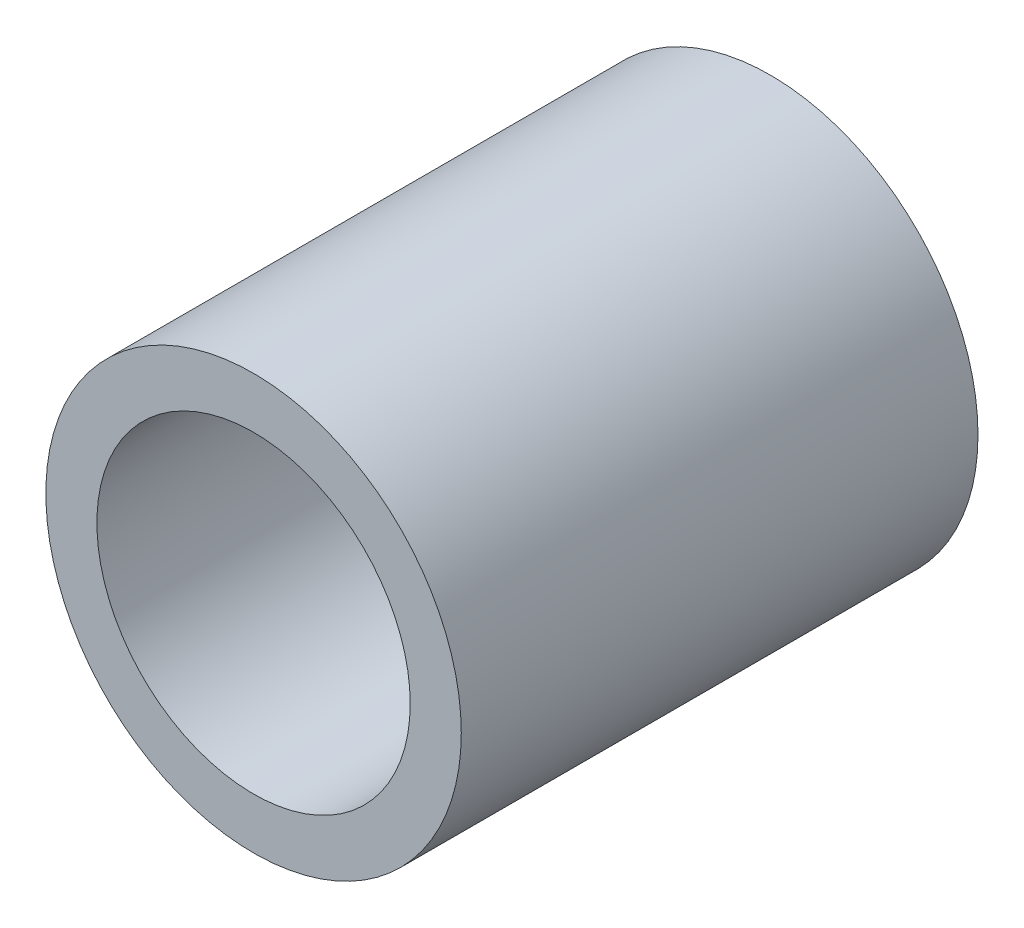
ISO-10303-21;
HEADER;
FILE_DESCRIPTION(('STEP AP214'),'2;1');
FILE_NAME('part.step','',(''),(''),'','','');
FILE_SCHEMA(('AUTOMOTIVE_DESIGN { 1 0 10303 214 1 1 1 1 }'));
ENDSEC;
DATA;
#1=APPLICATION_CONTEXT('core data for automotive mechanical design processes');
#2=APPLICATION_PROTOCOL_DEFINITION('international standard','automotive_design',2000,#1);
#3=PRODUCT_CONTEXT('',#1,'mechanical');
#4=PRODUCT('Part','Part','',(#3));
#5=PRODUCT_RELATED_PRODUCT_CATEGORY('part','',(#4));
#6=PRODUCT_DEFINITION_FORMATION('','',#4);
#7=PRODUCT_DEFINITION_CONTEXT('part definition',#1,'design');
#8=PRODUCT_DEFINITION('design','',#6,#7);
#9=PRODUCT_DEFINITION_SHAPE('','',#8);
#10=(LENGTH_UNIT() NAMED_UNIT(*) SI_UNIT(.MILLI.,.METRE.));
#11=(NAMED_UNIT(*) PLANE_ANGLE_UNIT() SI_UNIT($,.RADIAN.));
#12=(NAMED_UNIT(*) SI_UNIT($,.STERADIAN.) SOLID_ANGLE_UNIT());
#13=UNCERTAINTY_MEASURE_WITH_UNIT(LENGTH_MEASURE(1.E-05),#10,'distance_accuracy_value','');
#14=(GEOMETRIC_REPRESENTATION_CONTEXT(3) GLOBAL_UNCERTAINTY_ASSIGNED_CONTEXT((#13)) GLOBAL_UNIT_ASSIGNED_CONTEXT((#10,
#11,#12)) REPRESENTATION_CONTEXT('',''));
#15=CARTESIAN_POINT('',(0.,0.,0.));
#16=DIRECTION('',(0.,0.,1.));
#17=DIRECTION('',(1.,0.,0.));
#18=AXIS2_PLACEMENT_3D('',#15,#16,#17);
#19=CARTESIAN_POINT('',(0.,0.,-7.9375));
#20=DIRECTION('',(0.,0.,1.));
#21=DIRECTION('',(1.,0.,0.));
#22=AXIS2_PLACEMENT_3D('',#19,#20,#21);
#23=CYLINDRICAL_SURFACE('',#22,4.8133);
#24=CARTESIAN_POINT('',(0.,0.,7.9375));
#25=DIRECTION('',(0.,0.,1.));
#26=DIRECTION('',(1.,0.,0.));
#27=AXIS2_PLACEMENT_3D('',#24,#25,#26);
#28=CIRCLE('',#27,4.8133);
#29=CARTESIAN_POINT('',(4.8133,0.,7.9375));
#30=VERTEX_POINT('',#29);
#31=EDGE_CURVE('E18',#30,#30,#28,.F.);
#32=ORIENTED_EDGE('',*,*,#31,.F.);
#33=EDGE_LOOP('',(#32));
#34=FACE_BOUND('',#33,.T.);
#35=CARTESIAN_POINT('',(0.,0.,-7.9375));
#36=DIRECTION('',(0.,0.,1.));
#37=DIRECTION('',(1.,0.,0.));
#38=AXIS2_PLACEMENT_3D('',#35,#36,#37);
#39=CIRCLE('',#38,4.8133);
#40=CARTESIAN_POINT('',(4.8133,0.,-7.9375));
#41=VERTEX_POINT('',#40);
#42=EDGE_CURVE('E27',#41,#41,#39,.T.);
#43=ORIENTED_EDGE('',*,*,#42,.F.);
#44=EDGE_LOOP('',(#43));
#45=FACE_BOUND('',#44,.T.);
#46=ADVANCED_FACE('F15',(#34,#45),#23,.F.);
#47=CARTESIAN_POINT('',(0.,6.38175,7.9375));
#48=DIRECTION('',(0.,0.,1.));
#49=DIRECTION('',(1.,0.,0.));
#50=AXIS2_PLACEMENT_3D('',#47,#48,#49);
#51=PLANE('',#50);
#52=CARTESIAN_POINT('',(0.,0.,7.9375));
#53=DIRECTION('',(0.,0.,1.));
#54=DIRECTION('',(1.,0.,0.));
#55=AXIS2_PLACEMENT_3D('',#52,#53,#54);
#56=CIRCLE('',#55,6.38175);
#57=CARTESIAN_POINT('',(6.38175,0.,7.9375));
#58=VERTEX_POINT('',#57);
#59=EDGE_CURVE('E22',#58,#58,#56,.F.);
#60=ORIENTED_EDGE('',*,*,#59,.F.);
#61=EDGE_LOOP('',(#60));
#62=FACE_BOUND('',#61,.T.);
#63=ORIENTED_EDGE('',*,*,#31,.T.);
#64=EDGE_LOOP('',(#63));
#65=FACE_BOUND('',#64,.T.);
#66=ADVANCED_FACE('F35',(#62,#65),#51,.T.);
#67=CARTESIAN_POINT('',(0.,4.8133,-7.9375));
#68=DIRECTION('',(0.,0.,-1.));
#69=DIRECTION('',(-1.,0.,0.));
#70=AXIS2_PLACEMENT_3D('',#67,#68,#69);
#71=PLANE('',#70);
#72=ORIENTED_EDGE('',*,*,#42,.T.);
#73=EDGE_LOOP('',(#72));
#74=FACE_BOUND('',#73,.T.);
#75=CARTESIAN_POINT('',(0.,0.,-7.9375));
#76=DIRECTION('',(0.,0.,1.));
#77=DIRECTION('',(1.,0.,0.));
#78=AXIS2_PLACEMENT_3D('',#75,#76,#77);
#79=CIRCLE('',#78,6.38175);
#80=CARTESIAN_POINT('',(6.38175,0.,-7.9375));
#81=VERTEX_POINT('',#80);
#82=EDGE_CURVE('E10',#81,#81,#79,.T.);
#83=ORIENTED_EDGE('',*,*,#82,.F.);
#84=EDGE_LOOP('',(#83));
#85=FACE_BOUND('',#84,.T.);
#86=ADVANCED_FACE('F43',(#74,#85),#71,.T.);
#87=CARTESIAN_POINT('',(0.,0.,-7.9375));
#88=DIRECTION('',(0.,0.,1.));
#89=DIRECTION('',(1.,0.,0.));
#90=AXIS2_PLACEMENT_3D('',#87,#88,#89);
#91=CYLINDRICAL_SURFACE('',#90,6.38175);
#92=ORIENTED_EDGE('',*,*,#82,.T.);
#93=EDGE_LOOP('',(#92));
#94=FACE_BOUND('',#93,.T.);
#95=ORIENTED_EDGE('',*,*,#59,.T.);
#96=EDGE_LOOP('',(#95));
#97=FACE_BOUND('',#96,.T.);
#98=ADVANCED_FACE('F45',(#94,#97),#91,.T.);
#99=CLOSED_SHELL('',(#46,#66,#86,#98));
#100=MANIFOLD_SOLID_BREP('B1',#99);
#101=ADVANCED_BREP_SHAPE_REPRESENTATION('',(#18,#100),#14);
#102=SHAPE_DEFINITION_REPRESENTATION(#9,#101);
ENDSEC;
END-ISO-10303-21;
